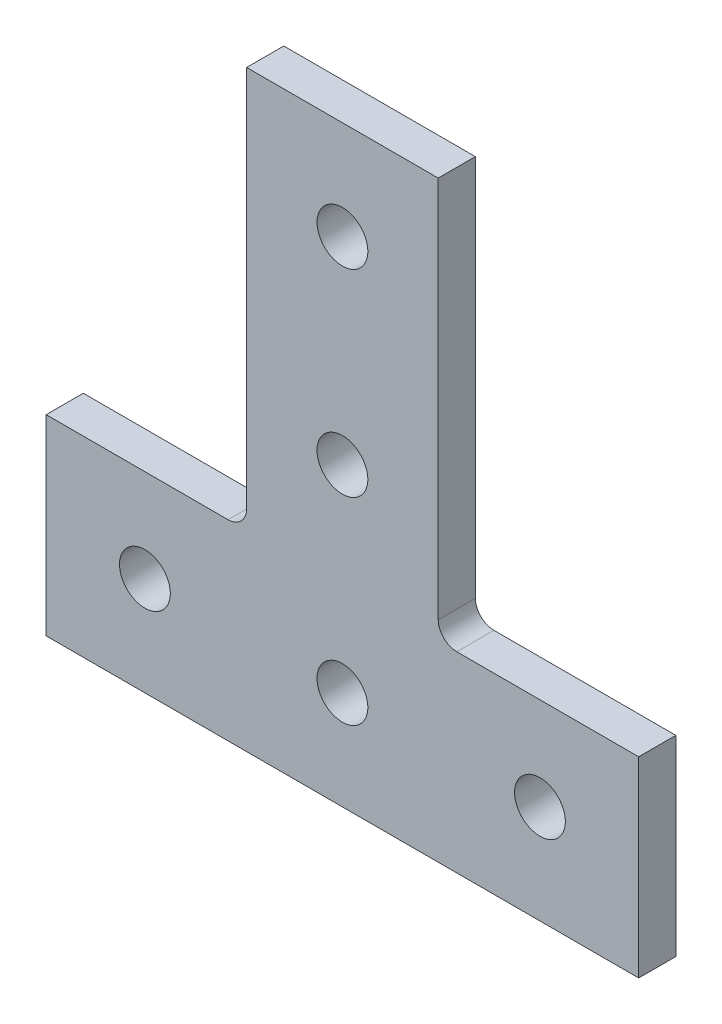
ISO-10303-21;
HEADER;
FILE_DESCRIPTION(('STEP AP214'),'2;1');
FILE_NAME('part.step','',(''),(''),'','','');
FILE_SCHEMA(('AUTOMOTIVE_DESIGN { 1 0 10303 214 1 1 1 1 }'));
ENDSEC;
DATA;
#1=APPLICATION_CONTEXT('core data for automotive mechanical design processes');
#2=APPLICATION_PROTOCOL_DEFINITION('international standard','automotive_design',2000,#1);
#3=PRODUCT_CONTEXT('',#1,'mechanical');
#4=PRODUCT('Part','Part','',(#3));
#5=PRODUCT_RELATED_PRODUCT_CATEGORY('part','',(#4));
#6=PRODUCT_DEFINITION_FORMATION('','',#4);
#7=PRODUCT_DEFINITION_CONTEXT('part definition',#1,'design');
#8=PRODUCT_DEFINITION('design','',#6,#7);
#9=PRODUCT_DEFINITION_SHAPE('','',#8);
#10=(LENGTH_UNIT() NAMED_UNIT(*) SI_UNIT(.MILLI.,.METRE.));
#11=(NAMED_UNIT(*) PLANE_ANGLE_UNIT() SI_UNIT($,.RADIAN.));
#12=(NAMED_UNIT(*) SI_UNIT($,.STERADIAN.) SOLID_ANGLE_UNIT());
#13=UNCERTAINTY_MEASURE_WITH_UNIT(LENGTH_MEASURE(1.E-05),#10,'distance_accuracy_value','');
#14=(GEOMETRIC_REPRESENTATION_CONTEXT(3) GLOBAL_UNCERTAINTY_ASSIGNED_CONTEXT((#13)) GLOBAL_UNIT_ASSIGNED_CONTEXT((#10,
#11,#12)) REPRESENTATION_CONTEXT('',''));
#15=CARTESIAN_POINT('',(0.,0.,0.));
#16=DIRECTION('',(0.,0.,1.));
#17=DIRECTION('',(1.,0.,0.));
#18=AXIS2_PLACEMENT_3D('',#15,#16,#17);
#19=CARTESIAN_POINT('',(-14.7066,27.0256,0.));
#20=DIRECTION('',(0.,0.,1.));
#21=DIRECTION('',(1.,0.,0.));
#22=AXIS2_PLACEMENT_3D('',#19,#20,#21);
#23=CYLINDRICAL_SURFACE('',#22,2.3876);
#24=CARTESIAN_POINT('',(-14.7066,27.0256,4.7752));
#25=DIRECTION('',(0.,0.,-1.));
#26=DIRECTION('',(-1.,0.,0.));
#27=AXIS2_PLACEMENT_3D('',#24,#25,#26);
#28=CIRCLE('',#27,2.3876);
#29=CARTESIAN_POINT('',(-12.319,27.0256,4.7752));
#30=VERTEX_POINT('',#29);
#31=CARTESIAN_POINT('',(-14.7066,24.638,4.7752));
#32=VERTEX_POINT('',#31);
#33=EDGE_CURVE('E141',#30,#32,#28,.T.);
#34=ORIENTED_EDGE('',*,*,#33,.F.);
#35=DIRECTION('',(0.,0.,1.));
#36=VECTOR('',#35,1.);
#37=CARTESIAN_POINT('',(-12.319,27.0256,0.));
#38=LINE('',#37,#36);
#39=CARTESIAN_POINT('',(-12.319,27.0256,0.));
#40=VERTEX_POINT('',#39);
#41=EDGE_CURVE('E11',#40,#30,#38,.T.);
#42=ORIENTED_EDGE('',*,*,#41,.F.);
#43=CARTESIAN_POINT('',(-14.7066,27.0256,0.));
#44=DIRECTION('',(0.,0.,-1.));
#45=DIRECTION('',(-1.,0.,0.));
#46=AXIS2_PLACEMENT_3D('',#43,#44,#45);
#47=CIRCLE('',#46,2.3876);
#48=CARTESIAN_POINT('',(-14.7066,24.638,0.));
#49=VERTEX_POINT('',#48);
#50=EDGE_CURVE('E168',#40,#49,#47,.T.);
#51=ORIENTED_EDGE('',*,*,#50,.T.);
#52=DIRECTION('',(0.,0.,1.));
#53=VECTOR('',#52,1.);
#54=CARTESIAN_POINT('',(-14.7066,24.638,0.));
#55=LINE('',#54,#53);
#56=EDGE_CURVE('E35',#49,#32,#55,.T.);
#57=ORIENTED_EDGE('',*,*,#56,.T.);
#58=EDGE_LOOP('',(#34,#42,#51,#57));
#59=FACE_BOUND('',#58,.T.);
#60=ADVANCED_FACE('F32',(#59),#23,.F.);
#61=CARTESIAN_POINT('',(-12.319,76.2,0.));
#62=DIRECTION('',(-1.,0.,0.));
#63=DIRECTION('',(0.,0.,1.));
#64=AXIS2_PLACEMENT_3D('',#61,#62,#63);
#65=PLANE('',#64);
#66=DIRECTION('',(0.,-1.,0.));
#67=VECTOR('',#66,1.);
#68=CARTESIAN_POINT('',(-12.319,76.2,4.7752));
#69=LINE('',#68,#67);
#70=CARTESIAN_POINT('',(-12.319,76.2,4.7752));
#71=VERTEX_POINT('',#70);
#72=EDGE_CURVE('E166',#71,#30,#69,.T.);
#73=ORIENTED_EDGE('',*,*,#72,.F.);
#74=DIRECTION('',(0.,0.,1.));
#75=VECTOR('',#74,1.);
#76=CARTESIAN_POINT('',(-12.319,76.2,0.));
#77=LINE('',#76,#75);
#78=CARTESIAN_POINT('',(-12.319,76.2,0.));
#79=VERTEX_POINT('',#78);
#80=EDGE_CURVE('E41',#79,#71,#77,.T.);
#81=ORIENTED_EDGE('',*,*,#80,.F.);
#82=DIRECTION('',(0.,-1.,0.));
#83=VECTOR('',#82,1.);
#84=CARTESIAN_POINT('',(-12.319,76.2,0.));
#85=LINE('',#84,#83);
#86=EDGE_CURVE('E131',#79,#40,#85,.T.);
#87=ORIENTED_EDGE('',*,*,#86,.T.);
#88=ORIENTED_EDGE('',*,*,#41,.T.);
#89=EDGE_LOOP('',(#73,#81,#87,#88));
#90=FACE_BOUND('',#89,.T.);
#91=ADVANCED_FACE('F184',(#90),#65,.T.);
#92=CARTESIAN_POINT('',(12.319,76.2,0.));
#93=DIRECTION('',(0.,1.,0.));
#94=DIRECTION('',(0.,0.,1.));
#95=AXIS2_PLACEMENT_3D('',#92,#93,#94);
#96=PLANE('',#95);
#97=DIRECTION('',(-1.,0.,0.));
#98=VECTOR('',#97,1.);
#99=CARTESIAN_POINT('',(12.319,76.2,4.7752));
#100=LINE('',#99,#98);
#101=CARTESIAN_POINT('',(12.319,76.2,4.7752));
#102=VERTEX_POINT('',#101);
#103=EDGE_CURVE('E118',#102,#71,#100,.T.);
#104=ORIENTED_EDGE('',*,*,#103,.F.);
#105=DIRECTION('',(0.,0.,1.));
#106=VECTOR('',#105,1.);
#107=CARTESIAN_POINT('',(12.319,76.2,0.));
#108=LINE('',#107,#106);
#109=CARTESIAN_POINT('',(12.319,76.2,0.));
#110=VERTEX_POINT('',#109);
#111=EDGE_CURVE('E113',#110,#102,#108,.T.);
#112=ORIENTED_EDGE('',*,*,#111,.F.);
#113=DIRECTION('',(-1.,0.,0.));
#114=VECTOR('',#113,1.);
#115=CARTESIAN_POINT('',(12.319,76.2,0.));
#116=LINE('',#115,#114);
#117=EDGE_CURVE('E116',#110,#79,#116,.T.);
#118=ORIENTED_EDGE('',*,*,#117,.T.);
#119=ORIENTED_EDGE('',*,*,#80,.T.);
#120=EDGE_LOOP('',(#104,#112,#118,#119));
#121=FACE_BOUND('',#120,.T.);
#122=ADVANCED_FACE('F115',(#121),#96,.T.);
#123=CARTESIAN_POINT('',(12.319,27.0256,0.));
#124=DIRECTION('',(1.,0.,0.));
#125=DIRECTION('',(0.,1.,0.));
#126=AXIS2_PLACEMENT_3D('',#123,#124,#125);
#127=PLANE('',#126);
#128=DIRECTION('',(0.,1.,0.));
#129=VECTOR('',#128,1.);
#130=CARTESIAN_POINT('',(12.319,27.0256,4.7752));
#131=LINE('',#130,#129);
#132=CARTESIAN_POINT('',(12.319,27.0256,4.7752));
#133=VERTEX_POINT('',#132);
#134=EDGE_CURVE('E163',#133,#102,#131,.T.);
#135=ORIENTED_EDGE('',*,*,#134,.F.);
#136=DIRECTION('',(0.,0.,1.));
#137=VECTOR('',#136,1.);
#138=CARTESIAN_POINT('',(12.319,27.0256,0.));
#139=LINE('',#138,#137);
#140=CARTESIAN_POINT('',(12.319,27.0256,0.));
#141=VERTEX_POINT('',#140);
#142=EDGE_CURVE('E123',#141,#133,#139,.T.);
#143=ORIENTED_EDGE('',*,*,#142,.F.);
#144=DIRECTION('',(0.,1.,0.));
#145=VECTOR('',#144,1.);
#146=CARTESIAN_POINT('',(12.319,27.0256,0.));
#147=LINE('',#146,#145);
#148=EDGE_CURVE('E129',#141,#110,#147,.T.);
#149=ORIENTED_EDGE('',*,*,#148,.T.);
#150=ORIENTED_EDGE('',*,*,#111,.T.);
#151=EDGE_LOOP('',(#135,#143,#149,#150));
#152=FACE_BOUND('',#151,.T.);
#153=ADVANCED_FACE('F133',(#152),#127,.T.);
#154=CARTESIAN_POINT('',(14.7066,27.0256,0.));
#155=DIRECTION('',(0.,0.,1.));
#156=DIRECTION('',(1.,0.,0.));
#157=AXIS2_PLACEMENT_3D('',#154,#155,#156);
#158=CYLINDRICAL_SURFACE('',#157,2.3876);
#159=CARTESIAN_POINT('',(14.7066,27.0256,4.7752));
#160=DIRECTION('',(0.,0.,-1.));
#161=DIRECTION('',(-1.,0.,0.));
#162=AXIS2_PLACEMENT_3D('',#159,#160,#161);
#163=CIRCLE('',#162,2.3876);
#164=CARTESIAN_POINT('',(14.7066,24.638,4.7752));
#165=VERTEX_POINT('',#164);
#166=EDGE_CURVE('E160',#165,#133,#163,.T.);
#167=ORIENTED_EDGE('',*,*,#166,.F.);
#168=DIRECTION('',(0.,0.,1.));
#169=VECTOR('',#168,1.);
#170=CARTESIAN_POINT('',(14.7066,24.638,0.));
#171=LINE('',#170,#169);
#172=CARTESIAN_POINT('',(14.7066,24.638,0.));
#173=VERTEX_POINT('',#172);
#174=EDGE_CURVE('E172',#173,#165,#171,.T.);
#175=ORIENTED_EDGE('',*,*,#174,.F.);
#176=CARTESIAN_POINT('',(14.7066,27.0256,0.));
#177=DIRECTION('',(0.,0.,-1.));
#178=DIRECTION('',(-1.,0.,0.));
#179=AXIS2_PLACEMENT_3D('',#176,#177,#178);
#180=CIRCLE('',#179,2.3876);
#181=EDGE_CURVE('E134',#173,#141,#180,.T.);
#182=ORIENTED_EDGE('',*,*,#181,.T.);
#183=ORIENTED_EDGE('',*,*,#142,.T.);
#184=EDGE_LOOP('',(#167,#175,#182,#183));
#185=FACE_BOUND('',#184,.T.);
#186=ADVANCED_FACE('F197',(#185),#158,.F.);
#187=CARTESIAN_POINT('',(38.1,24.638,0.));
#188=DIRECTION('',(0.,1.,0.));
#189=DIRECTION('',(0.,0.,1.));
#190=AXIS2_PLACEMENT_3D('',#187,#188,#189);
#191=PLANE('',#190);
#192=DIRECTION('',(-1.,0.,0.));
#193=VECTOR('',#192,1.);
#194=CARTESIAN_POINT('',(38.1,24.638,4.7752));
#195=LINE('',#194,#193);
#196=CARTESIAN_POINT('',(38.1,24.638,4.7752));
#197=VERTEX_POINT('',#196);
#198=EDGE_CURVE('E157',#197,#165,#195,.T.);
#199=ORIENTED_EDGE('',*,*,#198,.F.);
#200=DIRECTION('',(0.,0.,1.));
#201=VECTOR('',#200,1.);
#202=CARTESIAN_POINT('',(38.1,24.638,0.));
#203=LINE('',#202,#201);
#204=CARTESIAN_POINT('',(38.1,24.638,0.));
#205=VERTEX_POINT('',#204);
#206=EDGE_CURVE('E174',#205,#197,#203,.T.);
#207=ORIENTED_EDGE('',*,*,#206,.F.);
#208=DIRECTION('',(-1.,0.,0.));
#209=VECTOR('',#208,1.);
#210=CARTESIAN_POINT('',(38.1,24.638,0.));
#211=LINE('',#210,#209);
#212=EDGE_CURVE('E136',#205,#173,#211,.T.);
#213=ORIENTED_EDGE('',*,*,#212,.T.);
#214=ORIENTED_EDGE('',*,*,#174,.T.);
#215=EDGE_LOOP('',(#199,#207,#213,#214));
#216=FACE_BOUND('',#215,.T.);
#217=ADVANCED_FACE('F200',(#216),#191,.T.);
#218=CARTESIAN_POINT('',(38.1,0.,0.));
#219=DIRECTION('',(1.,0.,0.));
#220=DIRECTION('',(0.,0.,-1.));
#221=AXIS2_PLACEMENT_3D('',#218,#219,#220);
#222=PLANE('',#221);
#223=DIRECTION('',(0.,1.,0.));
#224=VECTOR('',#223,1.);
#225=CARTESIAN_POINT('',(38.1,0.,4.7752));
#226=LINE('',#225,#224);
#227=CARTESIAN_POINT('',(38.1,0.,4.7752));
#228=VERTEX_POINT('',#227);
#229=EDGE_CURVE('E154',#228,#197,#226,.T.);
#230=ORIENTED_EDGE('',*,*,#229,.F.);
#231=DIRECTION('',(0.,0.,1.));
#232=VECTOR('',#231,1.);
#233=CARTESIAN_POINT('',(38.1,0.,0.));
#234=LINE('',#233,#232);
#235=CARTESIAN_POINT('',(38.1,0.,0.));
#236=VERTEX_POINT('',#235);
#237=EDGE_CURVE('E176',#236,#228,#234,.T.);
#238=ORIENTED_EDGE('',*,*,#237,.F.);
#239=DIRECTION('',(0.,1.,0.));
#240=VECTOR('',#239,1.);
#241=CARTESIAN_POINT('',(38.1,0.,0.));
#242=LINE('',#241,#240);
#243=EDGE_CURVE('E290',#236,#205,#242,.T.);
#244=ORIENTED_EDGE('',*,*,#243,.T.);
#245=ORIENTED_EDGE('',*,*,#206,.T.);
#246=EDGE_LOOP('',(#230,#238,#244,#245));
#247=FACE_BOUND('',#246,.T.);
#248=ADVANCED_FACE('F204',(#247),#222,.T.);
#249=CARTESIAN_POINT('',(-38.1,0.,0.));
#250=DIRECTION('',(0.,-1.,0.));
#251=DIRECTION('',(0.,0.,-1.));
#252=AXIS2_PLACEMENT_3D('',#249,#250,#251);
#253=PLANE('',#252);
#254=DIRECTION('',(1.,0.,0.));
#255=VECTOR('',#254,1.);
#256=CARTESIAN_POINT('',(-38.1,0.,4.7752));
#257=LINE('',#256,#255);
#258=CARTESIAN_POINT('',(-38.1,0.,4.7752));
#259=VERTEX_POINT('',#258);
#260=EDGE_CURVE('E151',#259,#228,#257,.T.);
#261=ORIENTED_EDGE('',*,*,#260,.F.);
#262=DIRECTION('',(0.,0.,1.));
#263=VECTOR('',#262,1.);
#264=CARTESIAN_POINT('',(-38.1,0.,0.));
#265=LINE('',#264,#263);
#266=CARTESIAN_POINT('',(-38.1,0.,0.));
#267=VERTEX_POINT('',#266);
#268=EDGE_CURVE('E178',#267,#259,#265,.T.);
#269=ORIENTED_EDGE('',*,*,#268,.F.);
#270=DIRECTION('',(1.,0.,0.));
#271=VECTOR('',#270,1.);
#272=CARTESIAN_POINT('',(-38.1,0.,0.));
#273=LINE('',#272,#271);
#274=EDGE_CURVE('E287',#267,#236,#273,.T.);
#275=ORIENTED_EDGE('',*,*,#274,.T.);
#276=ORIENTED_EDGE('',*,*,#237,.T.);
#277=EDGE_LOOP('',(#261,#269,#275,#276));
#278=FACE_BOUND('',#277,.T.);
#279=ADVANCED_FACE('F208',(#278),#253,.T.);
#280=CARTESIAN_POINT('',(-38.1,24.638,0.));
#281=DIRECTION('',(-1.,0.,0.));
#282=DIRECTION('',(0.,0.,1.));
#283=AXIS2_PLACEMENT_3D('',#280,#281,#282);
#284=PLANE('',#283);
#285=DIRECTION('',(0.,-1.,0.));
#286=VECTOR('',#285,1.);
#287=CARTESIAN_POINT('',(-38.1,24.638,4.7752));
#288=LINE('',#287,#286);
#289=CARTESIAN_POINT('',(-38.1,24.638,4.7752));
#290=VERTEX_POINT('',#289);
#291=EDGE_CURVE('E148',#290,#259,#288,.T.);
#292=ORIENTED_EDGE('',*,*,#291,.F.);
#293=DIRECTION('',(0.,0.,1.));
#294=VECTOR('',#293,1.);
#295=CARTESIAN_POINT('',(-38.1,24.638,0.));
#296=LINE('',#295,#294);
#297=CARTESIAN_POINT('',(-38.1,24.638,0.));
#298=VERTEX_POINT('',#297);
#299=EDGE_CURVE('E179',#298,#290,#296,.T.);
#300=ORIENTED_EDGE('',*,*,#299,.F.);
#301=DIRECTION('',(0.,-1.,0.));
#302=VECTOR('',#301,1.);
#303=CARTESIAN_POINT('',(-38.1,24.638,0.));
#304=LINE('',#303,#302);
#305=EDGE_CURVE('E284',#298,#267,#304,.T.);
#306=ORIENTED_EDGE('',*,*,#305,.T.);
#307=ORIENTED_EDGE('',*,*,#268,.T.);
#308=EDGE_LOOP('',(#292,#300,#306,#307));
#309=FACE_BOUND('',#308,.T.);
#310=ADVANCED_FACE('F212',(#309),#284,.T.);
#311=CARTESIAN_POINT('',(-14.7066,24.638,0.));
#312=DIRECTION('',(0.,1.,0.));
#313=DIRECTION('',(0.,0.,1.));
#314=AXIS2_PLACEMENT_3D('',#311,#312,#313);
#315=PLANE('',#314);
#316=DIRECTION('',(-1.,0.,0.));
#317=VECTOR('',#316,1.);
#318=CARTESIAN_POINT('',(-14.7066,24.638,4.7752));
#319=LINE('',#318,#317);
#320=EDGE_CURVE('E144',#32,#290,#319,.T.);
#321=ORIENTED_EDGE('',*,*,#320,.F.);
#322=ORIENTED_EDGE('',*,*,#56,.F.);
#323=DIRECTION('',(-1.,0.,0.));
#324=VECTOR('',#323,1.);
#325=CARTESIAN_POINT('',(-14.7066,24.638,0.));
#326=LINE('',#325,#324);
#327=EDGE_CURVE('E282',#49,#298,#326,.T.);
#328=ORIENTED_EDGE('',*,*,#327,.T.);
#329=ORIENTED_EDGE('',*,*,#299,.T.);
#330=EDGE_LOOP('',(#321,#322,#328,#329));
#331=FACE_BOUND('',#330,.T.);
#332=ADVANCED_FACE('F181',(#331),#315,.T.);
#333=CARTESIAN_POINT('',(-14.7066,27.0256,0.));
#334=DIRECTION('',(0.,0.,-1.));
#335=DIRECTION('',(-1.,0.,0.));
#336=AXIS2_PLACEMENT_3D('',#333,#334,#335);
#337=PLANE('',#336);
#338=CARTESIAN_POINT('',(25.4,12.7,0.));
#339=DIRECTION('',(0.,0.,1.));
#340=DIRECTION('',(-1.,0.,0.));
#341=AXIS2_PLACEMENT_3D('',#338,#339,#340);
#342=CIRCLE('',#341,3.2639);
#343=CARTESIAN_POINT('',(22.1361,12.7,0.));
#344=VERTEX_POINT('',#343);
#345=EDGE_CURVE('E251',#344,#344,#342,.T.);
#346=ORIENTED_EDGE('',*,*,#345,.T.);
#347=EDGE_LOOP('',(#346));
#348=FACE_BOUND('',#347,.T.);
#349=CARTESIAN_POINT('',(0.,12.7,0.));
#350=DIRECTION('',(0.,0.,1.));
#351=DIRECTION('',(-1.,0.,0.));
#352=AXIS2_PLACEMENT_3D('',#349,#350,#351);
#353=CIRCLE('',#352,3.2639);
#354=CARTESIAN_POINT('',(-3.2639,12.7,0.));
#355=VERTEX_POINT('',#354);
#356=EDGE_CURVE('E259',#355,#355,#353,.T.);
#357=ORIENTED_EDGE('',*,*,#356,.T.);
#358=EDGE_LOOP('',(#357));
#359=FACE_BOUND('',#358,.T.);
#360=CARTESIAN_POINT('',(0.,63.5,0.));
#361=DIRECTION('',(0.,0.,1.));
#362=DIRECTION('',(-1.,0.,0.));
#363=AXIS2_PLACEMENT_3D('',#360,#361,#362);
#364=CIRCLE('',#363,3.2639);
#365=CARTESIAN_POINT('',(-3.2639,63.5,0.));
#366=VERTEX_POINT('',#365);
#367=EDGE_CURVE('E265',#366,#366,#364,.T.);
#368=ORIENTED_EDGE('',*,*,#367,.T.);
#369=EDGE_LOOP('',(#368));
#370=FACE_BOUND('',#369,.T.);
#371=CARTESIAN_POINT('',(0.,38.1,0.));
#372=DIRECTION('',(0.,0.,1.));
#373=DIRECTION('',(-1.,0.,0.));
#374=AXIS2_PLACEMENT_3D('',#371,#372,#373);
#375=CIRCLE('',#374,3.2639);
#376=CARTESIAN_POINT('',(-3.2639,38.1,0.));
#377=VERTEX_POINT('',#376);
#378=EDGE_CURVE('E271',#377,#377,#375,.T.);
#379=ORIENTED_EDGE('',*,*,#378,.T.);
#380=EDGE_LOOP('',(#379));
#381=FACE_BOUND('',#380,.T.);
#382=CARTESIAN_POINT('',(-25.4,12.7,0.));
#383=DIRECTION('',(0.,0.,1.));
#384=DIRECTION('',(-1.,0.,0.));
#385=AXIS2_PLACEMENT_3D('',#382,#383,#384);
#386=CIRCLE('',#385,3.2639);
#387=CARTESIAN_POINT('',(-28.6639,12.7,0.));
#388=VERTEX_POINT('',#387);
#389=EDGE_CURVE('E145',#388,#388,#386,.T.);
#390=ORIENTED_EDGE('',*,*,#389,.T.);
#391=EDGE_LOOP('',(#390));
#392=FACE_BOUND('',#391,.T.);
#393=ORIENTED_EDGE('',*,*,#50,.F.);
#394=ORIENTED_EDGE('',*,*,#86,.F.);
#395=ORIENTED_EDGE('',*,*,#117,.F.);
#396=ORIENTED_EDGE('',*,*,#148,.F.);
#397=ORIENTED_EDGE('',*,*,#181,.F.);
#398=ORIENTED_EDGE('',*,*,#212,.F.);
#399=ORIENTED_EDGE('',*,*,#243,.F.);
#400=ORIENTED_EDGE('',*,*,#274,.F.);
#401=ORIENTED_EDGE('',*,*,#305,.F.);
#402=ORIENTED_EDGE('',*,*,#327,.F.);
#403=EDGE_LOOP('',(#393,#394,#395,#396,#397,#398,#399,#400,#401,#402));
#404=FACE_BOUND('',#403,.T.);
#405=ADVANCED_FACE('F127',(#348,#359,#370,#381,#392,#404),#337,.T.);
#406=CARTESIAN_POINT('',(-14.7066,27.0256,4.7752));
#407=DIRECTION('',(0.,0.,-1.));
#408=DIRECTION('',(-1.,0.,0.));
#409=AXIS2_PLACEMENT_3D('',#406,#407,#408);
#410=PLANE('',#409);
#411=CARTESIAN_POINT('',(25.4,12.7,4.7752));
#412=DIRECTION('',(0.,0.,1.));
#413=DIRECTION('',(-1.,0.,0.));
#414=AXIS2_PLACEMENT_3D('',#411,#412,#413);
#415=CIRCLE('',#414,3.2639);
#416=CARTESIAN_POINT('',(22.1361,12.7,4.7752));
#417=VERTEX_POINT('',#416);
#418=EDGE_CURVE('E254',#417,#417,#415,.T.);
#419=ORIENTED_EDGE('',*,*,#418,.F.);
#420=EDGE_LOOP('',(#419));
#421=FACE_BOUND('',#420,.T.);
#422=CARTESIAN_POINT('',(0.,12.7,4.7752));
#423=DIRECTION('',(0.,0.,1.));
#424=DIRECTION('',(-1.,0.,0.));
#425=AXIS2_PLACEMENT_3D('',#422,#423,#424);
#426=CIRCLE('',#425,3.2639);
#427=CARTESIAN_POINT('',(-3.2639,12.7,4.7752));
#428=VERTEX_POINT('',#427);
#429=EDGE_CURVE('E256',#428,#428,#426,.T.);
#430=ORIENTED_EDGE('',*,*,#429,.F.);
#431=EDGE_LOOP('',(#430));
#432=FACE_BOUND('',#431,.T.);
#433=CARTESIAN_POINT('',(0.,63.5,4.7752));
#434=DIRECTION('',(0.,0.,1.));
#435=DIRECTION('',(-1.,0.,0.));
#436=AXIS2_PLACEMENT_3D('',#433,#434,#435);
#437=CIRCLE('',#436,3.2639);
#438=CARTESIAN_POINT('',(-3.2639,63.5,4.7752));
#439=VERTEX_POINT('',#438);
#440=EDGE_CURVE('E262',#439,#439,#437,.T.);
#441=ORIENTED_EDGE('',*,*,#440,.F.);
#442=EDGE_LOOP('',(#441));
#443=FACE_BOUND('',#442,.T.);
#444=CARTESIAN_POINT('',(0.,38.1,4.7752));
#445=DIRECTION('',(0.,0.,1.));
#446=DIRECTION('',(-1.,0.,0.));
#447=AXIS2_PLACEMENT_3D('',#444,#445,#446);
#448=CIRCLE('',#447,3.2639);
#449=CARTESIAN_POINT('',(-3.2639,38.1,4.7752));
#450=VERTEX_POINT('',#449);
#451=EDGE_CURVE('E268',#450,#450,#448,.T.);
#452=ORIENTED_EDGE('',*,*,#451,.F.);
#453=EDGE_LOOP('',(#452));
#454=FACE_BOUND('',#453,.T.);
#455=CARTESIAN_POINT('',(-25.4,12.7,4.7752));
#456=DIRECTION('',(0.,0.,1.));
#457=DIRECTION('',(-1.,0.,0.));
#458=AXIS2_PLACEMENT_3D('',#455,#456,#457);
#459=CIRCLE('',#458,3.2639);
#460=CARTESIAN_POINT('',(-28.6639,12.7,4.7752));
#461=VERTEX_POINT('',#460);
#462=EDGE_CURVE('E274',#461,#461,#459,.T.);
#463=ORIENTED_EDGE('',*,*,#462,.F.);
#464=EDGE_LOOP('',(#463));
#465=FACE_BOUND('',#464,.T.);
#466=ORIENTED_EDGE('',*,*,#33,.T.);
#467=ORIENTED_EDGE('',*,*,#320,.T.);
#468=ORIENTED_EDGE('',*,*,#291,.T.);
#469=ORIENTED_EDGE('',*,*,#260,.T.);
#470=ORIENTED_EDGE('',*,*,#229,.T.);
#471=ORIENTED_EDGE('',*,*,#198,.T.);
#472=ORIENTED_EDGE('',*,*,#166,.T.);
#473=ORIENTED_EDGE('',*,*,#134,.T.);
#474=ORIENTED_EDGE('',*,*,#103,.T.);
#475=ORIENTED_EDGE('',*,*,#72,.T.);
#476=EDGE_LOOP('',(#466,#467,#468,#469,#470,#471,#472,#473,#474,#475));
#477=FACE_BOUND('',#476,.T.);
#478=ADVANCED_FACE('F183',(#421,#432,#443,#454,#465,#477),#410,.F.);
#479=CARTESIAN_POINT('',(-25.4,12.7,0.));
#480=DIRECTION('',(0.,0.,1.));
#481=DIRECTION('',(1.,0.,0.));
#482=AXIS2_PLACEMENT_3D('',#479,#480,#481);
#483=CYLINDRICAL_SURFACE('',#482,3.2639);
#484=ORIENTED_EDGE('',*,*,#389,.F.);
#485=EDGE_LOOP('',(#484));
#486=FACE_BOUND('',#485,.T.);
#487=ORIENTED_EDGE('',*,*,#462,.T.);
#488=EDGE_LOOP('',(#487));
#489=FACE_BOUND('',#488,.T.);
#490=ADVANCED_FACE('F224',(#486,#489),#483,.F.);
#491=CARTESIAN_POINT('',(0.,38.1,0.));
#492=DIRECTION('',(0.,0.,1.));
#493=DIRECTION('',(1.,0.,0.));
#494=AXIS2_PLACEMENT_3D('',#491,#492,#493);
#495=CYLINDRICAL_SURFACE('',#494,3.2639);
#496=ORIENTED_EDGE('',*,*,#378,.F.);
#497=EDGE_LOOP('',(#496));
#498=FACE_BOUND('',#497,.T.);
#499=ORIENTED_EDGE('',*,*,#451,.T.);
#500=EDGE_LOOP('',(#499));
#501=FACE_BOUND('',#500,.T.);
#502=ADVANCED_FACE('F231',(#498,#501),#495,.F.);
#503=CARTESIAN_POINT('',(0.,63.5,0.));
#504=DIRECTION('',(0.,0.,1.));
#505=DIRECTION('',(1.,0.,0.));
#506=AXIS2_PLACEMENT_3D('',#503,#504,#505);
#507=CYLINDRICAL_SURFACE('',#506,3.2639);
#508=ORIENTED_EDGE('',*,*,#367,.F.);
#509=EDGE_LOOP('',(#508));
#510=FACE_BOUND('',#509,.T.);
#511=ORIENTED_EDGE('',*,*,#440,.T.);
#512=EDGE_LOOP('',(#511));
#513=FACE_BOUND('',#512,.T.);
#514=ADVANCED_FACE('F235',(#510,#513),#507,.F.);
#515=CARTESIAN_POINT('',(0.,12.7,0.));
#516=DIRECTION('',(0.,0.,1.));
#517=DIRECTION('',(1.,0.,0.));
#518=AXIS2_PLACEMENT_3D('',#515,#516,#517);
#519=CYLINDRICAL_SURFACE('',#518,3.2639);
#520=ORIENTED_EDGE('',*,*,#356,.F.);
#521=EDGE_LOOP('',(#520));
#522=FACE_BOUND('',#521,.T.);
#523=ORIENTED_EDGE('',*,*,#429,.T.);
#524=EDGE_LOOP('',(#523));
#525=FACE_BOUND('',#524,.T.);
#526=ADVANCED_FACE('F239',(#522,#525),#519,.F.);
#527=CARTESIAN_POINT('',(25.4,12.7,0.));
#528=DIRECTION('',(0.,0.,1.));
#529=DIRECTION('',(1.,0.,0.));
#530=AXIS2_PLACEMENT_3D('',#527,#528,#529);
#531=CYLINDRICAL_SURFACE('',#530,3.2639);
#532=ORIENTED_EDGE('',*,*,#345,.F.);
#533=EDGE_LOOP('',(#532));
#534=FACE_BOUND('',#533,.T.);
#535=ORIENTED_EDGE('',*,*,#418,.T.);
#536=EDGE_LOOP('',(#535));
#537=FACE_BOUND('',#536,.T.);
#538=ADVANCED_FACE('F243',(#534,#537),#531,.F.);
#539=CLOSED_SHELL('',(#60,#91,#122,#153,#186,#217,#248,#279,#310,#332,#405,#478,#490,#502,#514,
#526,#538));
#540=MANIFOLD_SOLID_BREP('B2',#539);
#541=ADVANCED_BREP_SHAPE_REPRESENTATION('',(#18,#540),#14);
#542=SHAPE_DEFINITION_REPRESENTATION(#9,#541);
ENDSEC;
END-ISO-10303-21;
